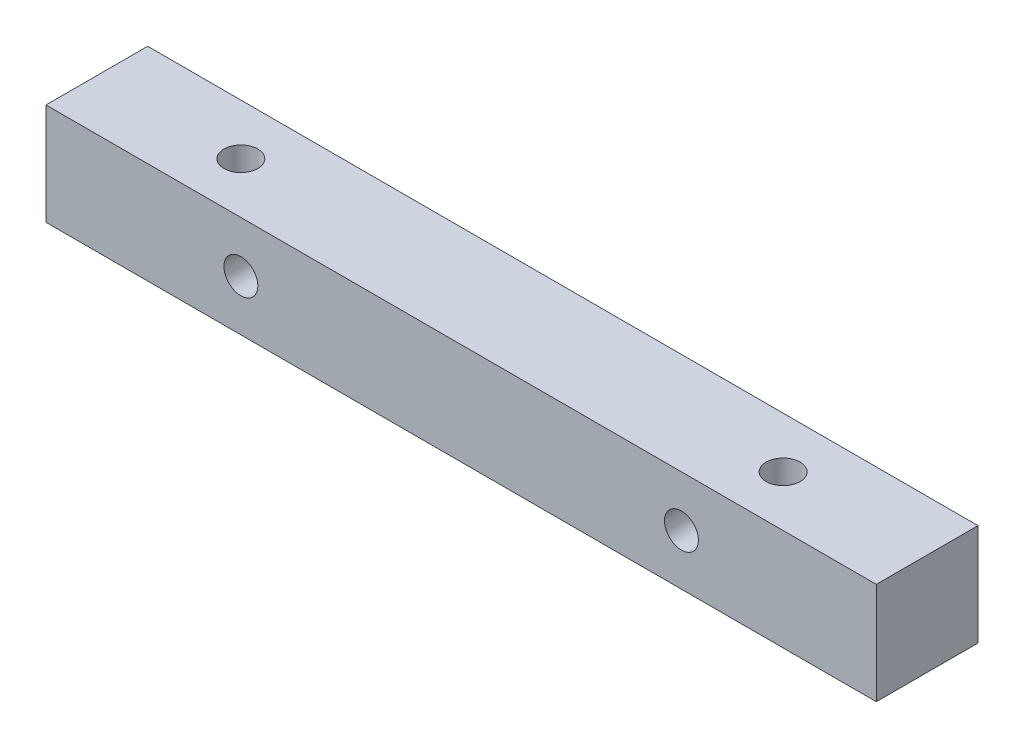
ISO-10303-21;
HEADER;
FILE_DESCRIPTION(('STEP AP214'),'2;1');
FILE_NAME('part.step','',(''),(''),'','','');
FILE_SCHEMA(('AUTOMOTIVE_DESIGN { 1 0 10303 214 1 1 1 1 }'));
ENDSEC;
DATA;
#1=APPLICATION_CONTEXT('core data for automotive mechanical design processes');
#2=APPLICATION_PROTOCOL_DEFINITION('international standard','automotive_design',2000,#1);
#3=PRODUCT_CONTEXT('',#1,'mechanical');
#4=PRODUCT('Part','Part','',(#3));
#5=PRODUCT_RELATED_PRODUCT_CATEGORY('part','',(#4));
#6=PRODUCT_DEFINITION_FORMATION('','',#4);
#7=PRODUCT_DEFINITION_CONTEXT('part definition',#1,'design');
#8=PRODUCT_DEFINITION('design','',#6,#7);
#9=PRODUCT_DEFINITION_SHAPE('','',#8);
#10=(LENGTH_UNIT() NAMED_UNIT(*) SI_UNIT(.MILLI.,.METRE.));
#11=(NAMED_UNIT(*) PLANE_ANGLE_UNIT() SI_UNIT($,.RADIAN.));
#12=(NAMED_UNIT(*) SI_UNIT($,.STERADIAN.) SOLID_ANGLE_UNIT());
#13=UNCERTAINTY_MEASURE_WITH_UNIT(LENGTH_MEASURE(1.E-05),#10,'distance_accuracy_value','');
#14=(GEOMETRIC_REPRESENTATION_CONTEXT(3) GLOBAL_UNCERTAINTY_ASSIGNED_CONTEXT((#13)) GLOBAL_UNIT_ASSIGNED_CONTEXT((#10,
#11,#12)) REPRESENTATION_CONTEXT('',''));
#15=CARTESIAN_POINT('',(0.,0.,0.));
#16=DIRECTION('',(0.,0.,1.));
#17=DIRECTION('',(1.,0.,0.));
#18=AXIS2_PLACEMENT_3D('',#15,#16,#17);
#19=CARTESIAN_POINT('',(49.,3.,3.));
#20=DIRECTION('',(0.,0.,-1.));
#21=DIRECTION('',(0.,1.,0.));
#22=AXIS2_PLACEMENT_3D('',#19,#20,#21);
#23=PLANE('',#22);
#24=CARTESIAN_POINT('',(11.5,0.,3.));
#25=DIRECTION('',(0.,0.,1.));
#26=DIRECTION('',(0.,-1.,0.));
#27=AXIS2_PLACEMENT_3D('',#24,#25,#26);
#28=CIRCLE('',#27,0.999999999999999);
#29=CARTESIAN_POINT('',(11.5,-1.,3.));
#30=VERTEX_POINT('',#29);
#31=EDGE_CURVE('E117',#30,#30,#28,.T.);
#32=ORIENTED_EDGE('',*,*,#31,.F.);
#33=EDGE_LOOP('',(#32));
#34=FACE_BOUND('',#33,.T.);
#35=CARTESIAN_POINT('',(37.5,0.,3.));
#36=DIRECTION('',(0.,0.,1.));
#37=DIRECTION('',(0.,-1.,0.));
#38=AXIS2_PLACEMENT_3D('',#35,#36,#37);
#39=CIRCLE('',#38,1.);
#40=CARTESIAN_POINT('',(37.5,-0.999999999999998,3.));
#41=VERTEX_POINT('',#40);
#42=EDGE_CURVE('E114',#41,#41,#39,.T.);
#43=ORIENTED_EDGE('',*,*,#42,.F.);
#44=EDGE_LOOP('',(#43));
#45=FACE_BOUND('',#44,.T.);
#46=DIRECTION('',(0.,-1.,0.));
#47=VECTOR('',#46,1.);
#48=CARTESIAN_POINT('',(0.,3.,3.));
#49=LINE('',#48,#47);
#50=CARTESIAN_POINT('',(0.,3.,3.));
#51=VERTEX_POINT('',#50);
#52=CARTESIAN_POINT('',(0.,-3.,3.));
#53=VERTEX_POINT('',#52);
#54=EDGE_CURVE('E98',#51,#53,#49,.T.);
#55=ORIENTED_EDGE('',*,*,#54,.T.);
#56=DIRECTION('',(-1.,0.,0.));
#57=VECTOR('',#56,1.);
#58=CARTESIAN_POINT('',(49.,-3.,3.));
#59=LINE('',#58,#57);
#60=CARTESIAN_POINT('',(49.,-3.,3.));
#61=VERTEX_POINT('',#60);
#62=EDGE_CURVE('E11',#61,#53,#59,.T.);
#63=ORIENTED_EDGE('',*,*,#62,.F.);
#64=DIRECTION('',(0.,-1.,0.));
#65=VECTOR('',#64,1.);
#66=CARTESIAN_POINT('',(49.,3.,3.));
#67=LINE('',#66,#65);
#68=CARTESIAN_POINT('',(49.,3.,3.));
#69=VERTEX_POINT('',#68);
#70=EDGE_CURVE('E85',#69,#61,#67,.T.);
#71=ORIENTED_EDGE('',*,*,#70,.F.);
#72=DIRECTION('',(-1.,0.,0.));
#73=VECTOR('',#72,1.);
#74=CARTESIAN_POINT('',(49.,3.,3.));
#75=LINE('',#74,#73);
#76=EDGE_CURVE('E94',#69,#51,#75,.T.);
#77=ORIENTED_EDGE('',*,*,#76,.T.);
#78=EDGE_LOOP('',(#55,#63,#71,#77));
#79=FACE_BOUND('',#78,.T.);
#80=ADVANCED_FACE('F33',(#34,#45,#79),#23,.F.);
#81=CARTESIAN_POINT('',(49.,-3.,3.));
#82=DIRECTION('',(0.,1.,0.));
#83=DIRECTION('',(0.,0.,1.));
#84=AXIS2_PLACEMENT_3D('',#81,#82,#83);
#85=PLANE('',#84);
#86=CARTESIAN_POINT('',(8.5,-3.,0.));
#87=DIRECTION('',(0.,1.,0.));
#88=DIRECTION('',(0.,0.,1.));
#89=AXIS2_PLACEMENT_3D('',#86,#87,#88);
#90=CIRCLE('',#89,0.999999999999988);
#91=CARTESIAN_POINT('',(8.5,-3.,0.999999999999988));
#92=VERTEX_POINT('',#91);
#93=EDGE_CURVE('E126',#92,#92,#90,.T.);
#94=ORIENTED_EDGE('',*,*,#93,.T.);
#95=EDGE_LOOP('',(#94));
#96=FACE_BOUND('',#95,.T.);
#97=CARTESIAN_POINT('',(40.5,-3.,0.));
#98=DIRECTION('',(0.,1.,0.));
#99=DIRECTION('',(0.,0.,1.));
#100=AXIS2_PLACEMENT_3D('',#97,#98,#99);
#101=CIRCLE('',#100,0.999999999999987);
#102=CARTESIAN_POINT('',(40.5,-3.,0.999999999999983));
#103=VERTEX_POINT('',#102);
#104=EDGE_CURVE('E120',#103,#103,#101,.T.);
#105=ORIENTED_EDGE('',*,*,#104,.T.);
#106=EDGE_LOOP('',(#105));
#107=FACE_BOUND('',#106,.T.);
#108=DIRECTION('',(0.,0.,-1.));
#109=VECTOR('',#108,1.);
#110=CARTESIAN_POINT('',(0.,-3.,3.));
#111=LINE('',#110,#109);
#112=CARTESIAN_POINT('',(0.,-3.,-3.));
#113=VERTEX_POINT('',#112);
#114=EDGE_CURVE('E89',#53,#113,#111,.T.);
#115=ORIENTED_EDGE('',*,*,#114,.T.);
#116=DIRECTION('',(-1.,0.,0.));
#117=VECTOR('',#116,1.);
#118=CARTESIAN_POINT('',(49.,-3.,-3.));
#119=LINE('',#118,#117);
#120=CARTESIAN_POINT('',(49.,-3.,-3.));
#121=VERTEX_POINT('',#120);
#122=EDGE_CURVE('E42',#121,#113,#119,.T.);
#123=ORIENTED_EDGE('',*,*,#122,.F.);
#124=DIRECTION('',(0.,0.,-1.));
#125=VECTOR('',#124,1.);
#126=CARTESIAN_POINT('',(49.,-3.,3.));
#127=LINE('',#126,#125);
#128=EDGE_CURVE('E80',#61,#121,#127,.T.);
#129=ORIENTED_EDGE('',*,*,#128,.F.);
#130=ORIENTED_EDGE('',*,*,#62,.T.);
#131=EDGE_LOOP('',(#115,#123,#129,#130));
#132=FACE_BOUND('',#131,.T.);
#133=ADVANCED_FACE('F88',(#96,#107,#132),#85,.F.);
#134=CARTESIAN_POINT('',(49.,3.,-3.));
#135=DIRECTION('',(0.,0.,1.));
#136=DIRECTION('',(0.,-1.,0.));
#137=AXIS2_PLACEMENT_3D('',#134,#135,#136);
#138=PLANE('',#137);
#139=CARTESIAN_POINT('',(11.5,0.,-3.));
#140=DIRECTION('',(0.,0.,1.));
#141=DIRECTION('',(0.,-1.,0.));
#142=AXIS2_PLACEMENT_3D('',#139,#140,#141);
#143=CIRCLE('',#142,0.999999999999998);
#144=CARTESIAN_POINT('',(11.5,-0.999999999999998,-3.));
#145=VERTEX_POINT('',#144);
#146=EDGE_CURVE('E36',#145,#145,#143,.T.);
#147=ORIENTED_EDGE('',*,*,#146,.T.);
#148=EDGE_LOOP('',(#147));
#149=FACE_BOUND('',#148,.T.);
#150=CARTESIAN_POINT('',(37.5,0.,-3.));
#151=DIRECTION('',(0.,0.,1.));
#152=DIRECTION('',(0.,-1.,0.));
#153=AXIS2_PLACEMENT_3D('',#150,#151,#152);
#154=CIRCLE('',#153,0.999999999999997);
#155=CARTESIAN_POINT('',(37.5,-0.999999999999994,-3.));
#156=VERTEX_POINT('',#155);
#157=EDGE_CURVE('E101',#156,#156,#154,.T.);
#158=ORIENTED_EDGE('',*,*,#157,.T.);
#159=EDGE_LOOP('',(#158));
#160=FACE_BOUND('',#159,.T.);
#161=DIRECTION('',(0.,1.,0.));
#162=VECTOR('',#161,1.);
#163=CARTESIAN_POINT('',(0.,3.,-3.));
#164=LINE('',#163,#162);
#165=CARTESIAN_POINT('',(0.,3.,-3.));
#166=VERTEX_POINT('',#165);
#167=EDGE_CURVE('E67',#113,#166,#164,.T.);
#168=ORIENTED_EDGE('',*,*,#167,.T.);
#169=DIRECTION('',(-1.,0.,0.));
#170=VECTOR('',#169,1.);
#171=CARTESIAN_POINT('',(49.,3.,-3.));
#172=LINE('',#171,#170);
#173=CARTESIAN_POINT('',(49.,3.,-3.));
#174=VERTEX_POINT('',#173);
#175=EDGE_CURVE('E90',#174,#166,#172,.T.);
#176=ORIENTED_EDGE('',*,*,#175,.F.);
#177=DIRECTION('',(0.,1.,0.));
#178=VECTOR('',#177,1.);
#179=CARTESIAN_POINT('',(49.,3.,-3.));
#180=LINE('',#179,#178);
#181=EDGE_CURVE('E83',#121,#174,#180,.T.);
#182=ORIENTED_EDGE('',*,*,#181,.F.);
#183=ORIENTED_EDGE('',*,*,#122,.T.);
#184=EDGE_LOOP('',(#168,#176,#182,#183));
#185=FACE_BOUND('',#184,.T.);
#186=ADVANCED_FACE('F92',(#149,#160,#185),#138,.F.);
#187=CARTESIAN_POINT('',(49.,3.,3.));
#188=DIRECTION('',(0.,-1.,0.));
#189=DIRECTION('',(0.,0.,-1.));
#190=AXIS2_PLACEMENT_3D('',#187,#188,#189);
#191=PLANE('',#190);
#192=CARTESIAN_POINT('',(8.5,3.,0.));
#193=DIRECTION('',(0.,1.,0.));
#194=DIRECTION('',(0.,0.,1.));
#195=AXIS2_PLACEMENT_3D('',#192,#193,#194);
#196=CIRCLE('',#195,0.999999999999989);
#197=CARTESIAN_POINT('',(8.5,3.,0.999999999999989));
#198=VERTEX_POINT('',#197);
#199=EDGE_CURVE('E129',#198,#198,#196,.T.);
#200=ORIENTED_EDGE('',*,*,#199,.F.);
#201=EDGE_LOOP('',(#200));
#202=FACE_BOUND('',#201,.T.);
#203=CARTESIAN_POINT('',(40.5,3.,0.));
#204=DIRECTION('',(0.,1.,0.));
#205=DIRECTION('',(0.,0.,1.));
#206=AXIS2_PLACEMENT_3D('',#203,#204,#205);
#207=CIRCLE('',#206,0.999999999999987);
#208=CARTESIAN_POINT('',(40.5,3.,0.999999999999983));
#209=VERTEX_POINT('',#208);
#210=EDGE_CURVE('E123',#209,#209,#207,.T.);
#211=ORIENTED_EDGE('',*,*,#210,.F.);
#212=EDGE_LOOP('',(#211));
#213=FACE_BOUND('',#212,.T.);
#214=DIRECTION('',(0.,0.,1.));
#215=VECTOR('',#214,1.);
#216=CARTESIAN_POINT('',(0.,3.,3.));
#217=LINE('',#216,#215);
#218=EDGE_CURVE('E73',#166,#51,#217,.T.);
#219=ORIENTED_EDGE('',*,*,#218,.T.);
#220=ORIENTED_EDGE('',*,*,#76,.F.);
#221=DIRECTION('',(0.,0.,1.));
#222=VECTOR('',#221,1.);
#223=CARTESIAN_POINT('',(49.,3.,3.));
#224=LINE('',#223,#222);
#225=EDGE_CURVE('E50',#174,#69,#224,.T.);
#226=ORIENTED_EDGE('',*,*,#225,.F.);
#227=ORIENTED_EDGE('',*,*,#175,.T.);
#228=EDGE_LOOP('',(#219,#220,#226,#227));
#229=FACE_BOUND('',#228,.T.);
#230=ADVANCED_FACE('F106',(#202,#213,#229),#191,.F.);
#231=CARTESIAN_POINT('',(49.,0.,0.));
#232=DIRECTION('',(1.,0.,0.));
#233=DIRECTION('',(0.,0.,-1.));
#234=AXIS2_PLACEMENT_3D('',#231,#232,#233);
#235=PLANE('',#234);
#236=ORIENTED_EDGE('',*,*,#70,.T.);
#237=ORIENTED_EDGE('',*,*,#128,.T.);
#238=ORIENTED_EDGE('',*,*,#181,.T.);
#239=ORIENTED_EDGE('',*,*,#225,.T.);
#240=EDGE_LOOP('',(#236,#237,#238,#239));
#241=FACE_BOUND('',#240,.T.);
#242=ADVANCED_FACE('F81',(#241),#235,.T.);
#243=CARTESIAN_POINT('',(0.,0.,0.));
#244=DIRECTION('',(1.,0.,0.));
#245=DIRECTION('',(0.,0.,-1.));
#246=AXIS2_PLACEMENT_3D('',#243,#244,#245);
#247=PLANE('',#246);
#248=ORIENTED_EDGE('',*,*,#54,.F.);
#249=ORIENTED_EDGE('',*,*,#218,.F.);
#250=ORIENTED_EDGE('',*,*,#167,.F.);
#251=ORIENTED_EDGE('',*,*,#114,.F.);
#252=EDGE_LOOP('',(#248,#249,#250,#251));
#253=FACE_BOUND('',#252,.T.);
#254=ADVANCED_FACE('F109',(#253),#247,.F.);
#255=CARTESIAN_POINT('',(37.5,0.,3.));
#256=DIRECTION('',(0.,0.,1.));
#257=DIRECTION('',(0.,-1.,0.));
#258=AXIS2_PLACEMENT_3D('',#255,#256,#257);
#259=CYLINDRICAL_SURFACE('',#258,0.999999999999997);
#260=ORIENTED_EDGE('',*,*,#42,.T.);
#261=EDGE_LOOP('',(#260));
#262=FACE_BOUND('',#261,.T.);
#263=ORIENTED_EDGE('',*,*,#157,.F.);
#264=EDGE_LOOP('',(#263));
#265=FACE_BOUND('',#264,.T.);
#266=ADVANCED_FACE('F160',(#262,#265),#259,.F.);
#267=CARTESIAN_POINT('',(11.5,0.,3.));
#268=DIRECTION('',(0.,0.,1.));
#269=DIRECTION('',(0.,-1.,0.));
#270=AXIS2_PLACEMENT_3D('',#267,#268,#269);
#271=CYLINDRICAL_SURFACE('',#270,0.999999999999998);
#272=ORIENTED_EDGE('',*,*,#31,.T.);
#273=EDGE_LOOP('',(#272));
#274=FACE_BOUND('',#273,.T.);
#275=ORIENTED_EDGE('',*,*,#146,.F.);
#276=EDGE_LOOP('',(#275));
#277=FACE_BOUND('',#276,.T.);
#278=ADVANCED_FACE('F144',(#274,#277),#271,.F.);
#279=CARTESIAN_POINT('',(40.5,3.,0.));
#280=DIRECTION('',(0.,1.,0.));
#281=DIRECTION('',(0.,0.,1.));
#282=AXIS2_PLACEMENT_3D('',#279,#280,#281);
#283=CYLINDRICAL_SURFACE('',#282,0.999999999999987);
#284=ORIENTED_EDGE('',*,*,#210,.T.);
#285=EDGE_LOOP('',(#284));
#286=FACE_BOUND('',#285,.T.);
#287=ORIENTED_EDGE('',*,*,#104,.F.);
#288=EDGE_LOOP('',(#287));
#289=FACE_BOUND('',#288,.T.);
#290=ADVANCED_FACE('F141',(#286,#289),#283,.F.);
#291=CARTESIAN_POINT('',(8.5,3.,0.));
#292=DIRECTION('',(0.,1.,0.));
#293=DIRECTION('',(0.,0.,1.));
#294=AXIS2_PLACEMENT_3D('',#291,#292,#293);
#295=CYLINDRICAL_SURFACE('',#294,0.999999999999988);
#296=ORIENTED_EDGE('',*,*,#199,.T.);
#297=EDGE_LOOP('',(#296));
#298=FACE_BOUND('',#297,.T.);
#299=ORIENTED_EDGE('',*,*,#93,.F.);
#300=EDGE_LOOP('',(#299));
#301=FACE_BOUND('',#300,.T.);
#302=ADVANCED_FACE('F133',(#298,#301),#295,.F.);
#303=CLOSED_SHELL('',(#80,#133,#186,#230,#242,#254,#266,#278,#290,#302));
#304=MANIFOLD_SOLID_BREP('B2',#303);
#305=ADVANCED_BREP_SHAPE_REPRESENTATION('',(#18,#304),#14);
#306=SHAPE_DEFINITION_REPRESENTATION(#9,#305);
ENDSEC;
END-ISO-10303-21;
